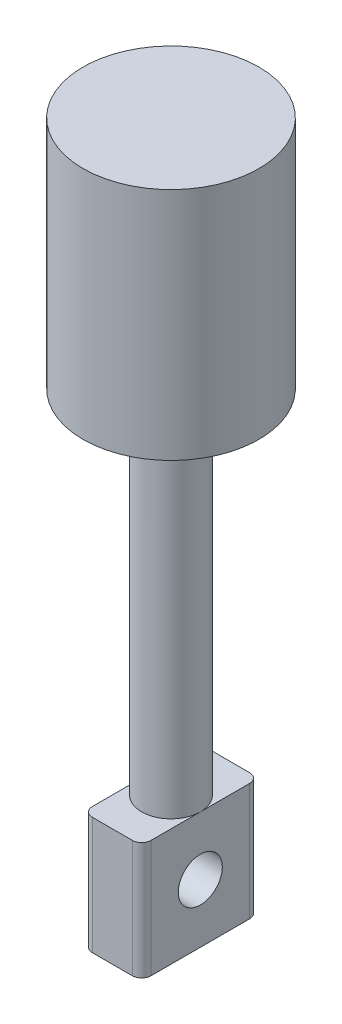
ISO-10303-21;
HEADER;
FILE_DESCRIPTION(('STEP AP214'),'2;1');
FILE_NAME('part.step','',(''),(''),'','','');
FILE_SCHEMA(('AUTOMOTIVE_DESIGN { 1 0 10303 214 1 1 1 1 }'));
ENDSEC;
DATA;
#1=APPLICATION_CONTEXT('core data for automotive mechanical design processes');
#2=APPLICATION_PROTOCOL_DEFINITION('international standard','automotive_design',2000,#1);
#3=PRODUCT_CONTEXT('',#1,'mechanical');
#4=PRODUCT('Part','Part','',(#3));
#5=PRODUCT_RELATED_PRODUCT_CATEGORY('part','',(#4));
#6=PRODUCT_DEFINITION_FORMATION('','',#4);
#7=PRODUCT_DEFINITION_CONTEXT('part definition',#1,'design');
#8=PRODUCT_DEFINITION('design','',#6,#7);
#9=PRODUCT_DEFINITION_SHAPE('','',#8);
#10=(LENGTH_UNIT() NAMED_UNIT(*) SI_UNIT(.MILLI.,.METRE.));
#11=(NAMED_UNIT(*) PLANE_ANGLE_UNIT() SI_UNIT($,.RADIAN.));
#12=(NAMED_UNIT(*) SI_UNIT($,.STERADIAN.) SOLID_ANGLE_UNIT());
#13=UNCERTAINTY_MEASURE_WITH_UNIT(LENGTH_MEASURE(1.E-05),#10,'distance_accuracy_value','');
#14=(GEOMETRIC_REPRESENTATION_CONTEXT(3) GLOBAL_UNCERTAINTY_ASSIGNED_CONTEXT((#13)) GLOBAL_UNIT_ASSIGNED_CONTEXT((#10,
#11,#12)) REPRESENTATION_CONTEXT('',''));
#15=CARTESIAN_POINT('',(0.,0.,0.));
#16=DIRECTION('',(0.,0.,1.));
#17=DIRECTION('',(1.,0.,0.));
#18=AXIS2_PLACEMENT_3D('',#15,#16,#17);
#19=CARTESIAN_POINT('',(0.,-12.7,0.));
#20=DIRECTION('',(0.,1.,0.));
#21=DIRECTION('',(0.,0.,1.));
#22=AXIS2_PLACEMENT_3D('',#19,#20,#21);
#23=CYLINDRICAL_SURFACE('',#22,4.7625);
#24=CARTESIAN_POINT('',(0.,-12.7,0.));
#25=DIRECTION('',(0.,1.,0.));
#26=DIRECTION('',(0.,0.,1.));
#27=AXIS2_PLACEMENT_3D('',#24,#25,#26);
#28=CIRCLE('',#27,4.7625);
#29=CARTESIAN_POINT('',(0.,-12.7,4.7625));
#30=VERTEX_POINT('',#29);
#31=EDGE_CURVE('E163',#30,#30,#28,.T.);
#32=ORIENTED_EDGE('',*,*,#31,.T.);
#33=EDGE_LOOP('',(#32));
#34=FACE_BOUND('',#33,.T.);
#35=CARTESIAN_POINT('',(0.,0.,0.));
#36=DIRECTION('',(0.,1.,0.));
#37=DIRECTION('',(0.,0.,1.));
#38=AXIS2_PLACEMENT_3D('',#35,#36,#37);
#39=CIRCLE('',#38,4.7625);
#40=CARTESIAN_POINT('',(0.,0.,4.7625));
#41=VERTEX_POINT('',#40);
#42=EDGE_CURVE('E132',#41,#41,#39,.T.);
#43=ORIENTED_EDGE('',*,*,#42,.F.);
#44=EDGE_LOOP('',(#43));
#45=FACE_BOUND('',#44,.T.);
#46=ADVANCED_FACE('F37',(#34,#45),#23,.T.);
#47=CARTESIAN_POINT('',(0.,-12.7,0.));
#48=DIRECTION('',(0.,1.,0.));
#49=DIRECTION('',(0.,0.,1.));
#50=AXIS2_PLACEMENT_3D('',#47,#48,#49);
#51=PLANE('',#50);
#52=CARTESIAN_POINT('',(0.,-12.7,0.));
#53=DIRECTION('',(0.,-1.,0.));
#54=DIRECTION('',(0.,0.,-1.));
#55=AXIS2_PLACEMENT_3D('',#52,#53,#54);
#56=CIRCLE('',#55,1.5875);
#57=CARTESIAN_POINT('',(0.,-12.7,-1.5875));
#58=VERTEX_POINT('',#57);
#59=EDGE_CURVE('E159',#58,#58,#56,.T.);
#60=ORIENTED_EDGE('',*,*,#59,.F.);
#61=EDGE_LOOP('',(#60));
#62=FACE_BOUND('',#61,.T.);
#63=ORIENTED_EDGE('',*,*,#31,.F.);
#64=EDGE_LOOP('',(#63));
#65=FACE_BOUND('',#64,.T.);
#66=ADVANCED_FACE('F225',(#62,#65),#51,.F.);
#67=CARTESIAN_POINT('',(0.,0.,0.));
#68=DIRECTION('',(0.,1.,0.));
#69=DIRECTION('',(0.,0.,1.));
#70=AXIS2_PLACEMENT_3D('',#67,#68,#69);
#71=PLANE('',#70);
#72=ORIENTED_EDGE('',*,*,#42,.T.);
#73=EDGE_LOOP('',(#72));
#74=FACE_BOUND('',#73,.T.);
#75=ADVANCED_FACE('F231',(#74),#71,.T.);
#76=CARTESIAN_POINT('',(0.,-31.75,0.));
#77=DIRECTION('',(0.,1.,0.));
#78=DIRECTION('',(0.,0.,1.));
#79=AXIS2_PLACEMENT_3D('',#76,#77,#78);
#80=CYLINDRICAL_SURFACE('',#79,1.5875);
#81=CARTESIAN_POINT('',(0.,-31.75,0.));
#82=DIRECTION('',(0.,-1.,0.));
#83=DIRECTION('',(0.,0.,-1.));
#84=AXIS2_PLACEMENT_3D('',#81,#82,#83);
#85=CIRCLE('',#84,1.5875);
#86=CARTESIAN_POINT('',(1.5875,-31.75,0.));
#87=VERTEX_POINT('',#86);
#88=CARTESIAN_POINT('',(-1.5875,-31.75,0.));
#89=VERTEX_POINT('',#88);
#90=EDGE_CURVE('E127',#87,#89,#85,.T.);
#91=ORIENTED_EDGE('',*,*,#90,.F.);
#92=EDGE_CURVE('E130',#89,#87,#85,.T.);
#93=ORIENTED_EDGE('',*,*,#92,.F.);
#94=EDGE_LOOP('',(#91,#93));
#95=FACE_BOUND('',#94,.T.);
#96=ORIENTED_EDGE('',*,*,#59,.T.);
#97=EDGE_LOOP('',(#96));
#98=FACE_BOUND('',#97,.T.);
#99=ADVANCED_FACE('F128',(#95,#98),#80,.T.);
#100=CARTESIAN_POINT('',(1.5875,-31.75,3.175));
#101=DIRECTION('',(0.,-1.,0.));
#102=DIRECTION('',(0.,0.,-1.));
#103=AXIS2_PLACEMENT_3D('',#100,#101,#102);
#104=PLANE('',#103);
#105=DIRECTION('',(-1.,0.,0.));
#106=VECTOR('',#105,1.);
#107=CARTESIAN_POINT('',(1.5875,-31.75,3.175));
#108=LINE('',#107,#106);
#109=CARTESIAN_POINT('',(1.0795,-31.75,3.175));
#110=VERTEX_POINT('',#109);
#111=CARTESIAN_POINT('',(-1.0795,-31.75,3.175));
#112=VERTEX_POINT('',#111);
#113=EDGE_CURVE('E122',#110,#112,#108,.T.);
#114=ORIENTED_EDGE('',*,*,#113,.F.);
#115=CARTESIAN_POINT('',(1.0795,-31.75,2.667));
#116=DIRECTION('',(0.,-1.,0.));
#117=DIRECTION('',(0.,0.,-1.));
#118=AXIS2_PLACEMENT_3D('',#115,#116,#117);
#119=CIRCLE('',#118,0.508);
#120=CARTESIAN_POINT('',(1.5875,-31.75,2.667));
#121=VERTEX_POINT('',#120);
#122=EDGE_CURVE('E11',#110,#121,#119,.F.);
#123=ORIENTED_EDGE('',*,*,#122,.T.);
#124=DIRECTION('',(0.,0.,1.));
#125=VECTOR('',#124,1.);
#126=CARTESIAN_POINT('',(1.5875,-31.75,3.175));
#127=LINE('',#126,#125);
#128=EDGE_CURVE('E116',#87,#121,#127,.T.);
#129=ORIENTED_EDGE('',*,*,#128,.F.);
#130=ORIENTED_EDGE('',*,*,#90,.T.);
#131=DIRECTION('',(0.,0.,1.));
#132=VECTOR('',#131,1.);
#133=CARTESIAN_POINT('',(-1.5875,-31.75,3.175));
#134=LINE('',#133,#132);
#135=CARTESIAN_POINT('',(-1.5875,-31.75,2.667));
#136=VERTEX_POINT('',#135);
#137=EDGE_CURVE('E148',#89,#136,#134,.T.);
#138=ORIENTED_EDGE('',*,*,#137,.T.);
#139=CARTESIAN_POINT('',(-1.0795,-31.75,2.667));
#140=DIRECTION('',(0.,-1.,0.));
#141=DIRECTION('',(0.,0.,-1.));
#142=AXIS2_PLACEMENT_3D('',#139,#140,#141);
#143=CIRCLE('',#142,0.508);
#144=EDGE_CURVE('E45',#136,#112,#143,.F.);
#145=ORIENTED_EDGE('',*,*,#144,.T.);
#146=EDGE_LOOP('',(#114,#123,#129,#130,#138,#145));
#147=FACE_BOUND('',#146,.T.);
#148=ADVANCED_FACE('F139',(#147),#104,.F.);
#149=DIRECTION('',(-1.,0.,0.));
#150=VECTOR('',#149,1.);
#151=CARTESIAN_POINT('',(1.5875,-31.75,-3.175));
#152=LINE('',#151,#150);
#153=CARTESIAN_POINT('',(1.0795,-31.75,-3.175));
#154=VERTEX_POINT('',#153);
#155=CARTESIAN_POINT('',(-1.0795,-31.75,-3.175));
#156=VERTEX_POINT('',#155);
#157=EDGE_CURVE('E152',#154,#156,#152,.T.);
#158=ORIENTED_EDGE('',*,*,#157,.T.);
#159=CARTESIAN_POINT('',(-1.0795,-31.75,-2.667));
#160=DIRECTION('',(0.,-1.,0.));
#161=DIRECTION('',(0.,0.,-1.));
#162=AXIS2_PLACEMENT_3D('',#159,#160,#161);
#163=CIRCLE('',#162,0.508);
#164=CARTESIAN_POINT('',(-1.5875,-31.75,-2.667));
#165=VERTEX_POINT('',#164);
#166=EDGE_CURVE('E174',#156,#165,#163,.F.);
#167=ORIENTED_EDGE('',*,*,#166,.T.);
#168=EDGE_CURVE('E137',#165,#89,#134,.T.);
#169=ORIENTED_EDGE('',*,*,#168,.T.);
#170=ORIENTED_EDGE('',*,*,#92,.T.);
#171=CARTESIAN_POINT('',(1.5875,-31.75,-2.667));
#172=VERTEX_POINT('',#171);
#173=EDGE_CURVE('E109',#172,#87,#127,.T.);
#174=ORIENTED_EDGE('',*,*,#173,.F.);
#175=CARTESIAN_POINT('',(1.0795,-31.75,-2.667));
#176=DIRECTION('',(0.,-1.,0.));
#177=DIRECTION('',(0.,0.,-1.));
#178=AXIS2_PLACEMENT_3D('',#175,#176,#177);
#179=CIRCLE('',#178,0.508);
#180=EDGE_CURVE('E172',#172,#154,#179,.F.);
#181=ORIENTED_EDGE('',*,*,#180,.T.);
#182=EDGE_LOOP('',(#158,#167,#169,#170,#174,#181));
#183=FACE_BOUND('',#182,.T.);
#184=ADVANCED_FACE('F135',(#183),#104,.F.);
#185=CARTESIAN_POINT('',(1.5875,0.,0.));
#186=DIRECTION('',(1.,0.,0.));
#187=DIRECTION('',(0.,0.,-1.));
#188=AXIS2_PLACEMENT_3D('',#185,#186,#187);
#189=PLANE('',#188);
#190=DIRECTION('',(0.,0.,-1.));
#191=VECTOR('',#190,1.);
#192=CARTESIAN_POINT('',(1.5875,-38.1,3.175));
#193=LINE('',#192,#191);
#194=CARTESIAN_POINT('',(1.5875,-38.1,2.667));
#195=VERTEX_POINT('',#194);
#196=CARTESIAN_POINT('',(1.5875,-38.1,-2.667));
#197=VERTEX_POINT('',#196);
#198=EDGE_CURVE('E141',#195,#197,#193,.T.);
#199=ORIENTED_EDGE('',*,*,#198,.T.);
#200=DIRECTION('',(0.,1.,0.));
#201=VECTOR('',#200,1.);
#202=CARTESIAN_POINT('',(1.5875,-31.75,-2.667));
#203=LINE('',#202,#201);
#204=EDGE_CURVE('E119',#197,#172,#203,.T.);
#205=ORIENTED_EDGE('',*,*,#204,.T.);
#206=ORIENTED_EDGE('',*,*,#173,.T.);
#207=ORIENTED_EDGE('',*,*,#128,.T.);
#208=DIRECTION('',(0.,-1.,0.));
#209=VECTOR('',#208,1.);
#210=CARTESIAN_POINT('',(1.5875,-38.1,2.667));
#211=LINE('',#210,#209);
#212=EDGE_CURVE('E188',#121,#195,#211,.T.);
#213=ORIENTED_EDGE('',*,*,#212,.T.);
#214=EDGE_LOOP('',(#199,#205,#206,#207,#213));
#215=FACE_BOUND('',#214,.T.);
#216=CARTESIAN_POINT('',(1.5875,-34.925,0.));
#217=DIRECTION('',(1.,0.,0.));
#218=DIRECTION('',(0.,0.,-1.));
#219=AXIS2_PLACEMENT_3D('',#216,#217,#218);
#220=CIRCLE('',#219,1.190625);
#221=CARTESIAN_POINT('',(1.5875,-34.925,-1.190625));
#222=VERTEX_POINT('',#221);
#223=EDGE_CURVE('E149',#222,#222,#220,.T.);
#224=ORIENTED_EDGE('',*,*,#223,.F.);
#225=EDGE_LOOP('',(#224));
#226=FACE_BOUND('',#225,.T.);
#227=ADVANCED_FACE('F112',(#215,#226),#189,.T.);
#228=CARTESIAN_POINT('',(-1.5875,0.,0.));
#229=DIRECTION('',(1.,0.,0.));
#230=DIRECTION('',(0.,0.,-1.));
#231=AXIS2_PLACEMENT_3D('',#228,#229,#230);
#232=PLANE('',#231);
#233=ORIENTED_EDGE('',*,*,#168,.F.);
#234=DIRECTION('',(0.,1.,0.));
#235=VECTOR('',#234,1.);
#236=CARTESIAN_POINT('',(-1.5875,0.,-2.66699999999999));
#237=LINE('',#236,#235);
#238=CARTESIAN_POINT('',(-1.5875,-38.1,-2.667));
#239=VERTEX_POINT('',#238);
#240=EDGE_CURVE('E178',#165,#239,#237,.F.);
#241=ORIENTED_EDGE('',*,*,#240,.T.);
#242=DIRECTION('',(0.,0.,-1.));
#243=VECTOR('',#242,1.);
#244=CARTESIAN_POINT('',(-1.5875,-38.1,3.175));
#245=LINE('',#244,#243);
#246=CARTESIAN_POINT('',(-1.5875,-38.1,2.667));
#247=VERTEX_POINT('',#246);
#248=EDGE_CURVE('E145',#247,#239,#245,.T.);
#249=ORIENTED_EDGE('',*,*,#248,.F.);
#250=DIRECTION('',(0.,-1.,0.));
#251=VECTOR('',#250,1.);
#252=CARTESIAN_POINT('',(-1.5875,0.,2.66699999999999));
#253=LINE('',#252,#251);
#254=EDGE_CURVE('E176',#247,#136,#253,.F.);
#255=ORIENTED_EDGE('',*,*,#254,.T.);
#256=ORIENTED_EDGE('',*,*,#137,.F.);
#257=EDGE_LOOP('',(#233,#241,#249,#255,#256));
#258=FACE_BOUND('',#257,.T.);
#259=CARTESIAN_POINT('',(-1.5875,-34.925,0.));
#260=DIRECTION('',(1.,0.,0.));
#261=DIRECTION('',(0.,0.,-1.));
#262=AXIS2_PLACEMENT_3D('',#259,#260,#261);
#263=CIRCLE('',#262,1.190625);
#264=CARTESIAN_POINT('',(-1.5875,-34.925,-1.190625));
#265=VERTEX_POINT('',#264);
#266=EDGE_CURVE('E391',#265,#265,#263,.T.);
#267=ORIENTED_EDGE('',*,*,#266,.T.);
#268=EDGE_LOOP('',(#267));
#269=FACE_BOUND('',#268,.T.);
#270=ADVANCED_FACE('F217',(#258,#269),#232,.F.);
#271=CARTESIAN_POINT('',(1.5875,-31.75,3.175));
#272=DIRECTION('',(0.,0.,-1.));
#273=DIRECTION('',(0.,1.,0.));
#274=AXIS2_PLACEMENT_3D('',#271,#272,#273);
#275=PLANE('',#274);
#276=DIRECTION('',(-1.,0.,0.));
#277=VECTOR('',#276,1.);
#278=CARTESIAN_POINT('',(1.5875,-38.1,3.175));
#279=LINE('',#278,#277);
#280=CARTESIAN_POINT('',(1.0795,-38.1,3.175));
#281=VERTEX_POINT('',#280);
#282=CARTESIAN_POINT('',(-1.0795,-38.1,3.175));
#283=VERTEX_POINT('',#282);
#284=EDGE_CURVE('E138',#281,#283,#279,.T.);
#285=ORIENTED_EDGE('',*,*,#284,.F.);
#286=DIRECTION('',(0.,-1.,0.));
#287=VECTOR('',#286,1.);
#288=CARTESIAN_POINT('',(1.0795,-31.75,3.175));
#289=LINE('',#288,#287);
#290=EDGE_CURVE('E58',#281,#110,#289,.F.);
#291=ORIENTED_EDGE('',*,*,#290,.T.);
#292=ORIENTED_EDGE('',*,*,#113,.T.);
#293=DIRECTION('',(0.,-1.,0.));
#294=VECTOR('',#293,1.);
#295=CARTESIAN_POINT('',(-1.0795,-31.75,3.175));
#296=LINE('',#295,#294);
#297=EDGE_CURVE('E191',#112,#283,#296,.T.);
#298=ORIENTED_EDGE('',*,*,#297,.T.);
#299=EDGE_LOOP('',(#285,#291,#292,#298));
#300=FACE_BOUND('',#299,.T.);
#301=ADVANCED_FACE('F195',(#300),#275,.F.);
#302=CARTESIAN_POINT('',(1.5875,-38.1,3.175));
#303=DIRECTION('',(0.,1.,0.));
#304=DIRECTION('',(0.,0.,1.));
#305=AXIS2_PLACEMENT_3D('',#302,#303,#304);
#306=PLANE('',#305);
#307=ORIENTED_EDGE('',*,*,#248,.T.);
#308=CARTESIAN_POINT('',(-1.0795,-38.1,-2.667));
#309=DIRECTION('',(0.,1.,0.));
#310=DIRECTION('',(0.,0.,1.));
#311=AXIS2_PLACEMENT_3D('',#308,#309,#310);
#312=CIRCLE('',#311,0.508);
#313=CARTESIAN_POINT('',(-1.0795,-38.1,-3.175));
#314=VERTEX_POINT('',#313);
#315=EDGE_CURVE('E186',#239,#314,#312,.F.);
#316=ORIENTED_EDGE('',*,*,#315,.T.);
#317=DIRECTION('',(-1.,0.,0.));
#318=VECTOR('',#317,1.);
#319=CARTESIAN_POINT('',(1.5875,-38.1,-3.175));
#320=LINE('',#319,#318);
#321=CARTESIAN_POINT('',(1.0795,-38.1,-3.175));
#322=VERTEX_POINT('',#321);
#323=EDGE_CURVE('E154',#322,#314,#320,.T.);
#324=ORIENTED_EDGE('',*,*,#323,.F.);
#325=CARTESIAN_POINT('',(1.0795,-38.1,-2.667));
#326=DIRECTION('',(0.,1.,0.));
#327=DIRECTION('',(0.,0.,1.));
#328=AXIS2_PLACEMENT_3D('',#325,#326,#327);
#329=CIRCLE('',#328,0.508);
#330=EDGE_CURVE('E184',#322,#197,#329,.F.);
#331=ORIENTED_EDGE('',*,*,#330,.T.);
#332=ORIENTED_EDGE('',*,*,#198,.F.);
#333=CARTESIAN_POINT('',(1.0795,-38.1,2.667));
#334=DIRECTION('',(0.,1.,0.));
#335=DIRECTION('',(0.,0.,1.));
#336=AXIS2_PLACEMENT_3D('',#333,#334,#335);
#337=CIRCLE('',#336,0.508);
#338=EDGE_CURVE('E182',#195,#281,#337,.F.);
#339=ORIENTED_EDGE('',*,*,#338,.T.);
#340=ORIENTED_EDGE('',*,*,#284,.T.);
#341=CARTESIAN_POINT('',(-1.0795,-38.1,2.667));
#342=DIRECTION('',(0.,1.,0.));
#343=DIRECTION('',(0.,0.,1.));
#344=AXIS2_PLACEMENT_3D('',#341,#342,#343);
#345=CIRCLE('',#344,0.508);
#346=EDGE_CURVE('E180',#283,#247,#345,.F.);
#347=ORIENTED_EDGE('',*,*,#346,.T.);
#348=EDGE_LOOP('',(#307,#316,#324,#331,#332,#339,#340,#347));
#349=FACE_BOUND('',#348,.T.);
#350=ADVANCED_FACE('F198',(#349),#306,.F.);
#351=CARTESIAN_POINT('',(1.5875,-31.75,-3.175));
#352=DIRECTION('',(0.,0.,1.));
#353=DIRECTION('',(0.,-1.,0.));
#354=AXIS2_PLACEMENT_3D('',#351,#352,#353);
#355=PLANE('',#354);
#356=ORIENTED_EDGE('',*,*,#323,.T.);
#357=DIRECTION('',(0.,1.,0.));
#358=VECTOR('',#357,1.);
#359=CARTESIAN_POINT('',(-1.0795,-31.75,-3.175));
#360=LINE('',#359,#358);
#361=EDGE_CURVE('E169',#314,#156,#360,.T.);
#362=ORIENTED_EDGE('',*,*,#361,.T.);
#363=ORIENTED_EDGE('',*,*,#157,.F.);
#364=DIRECTION('',(0.,1.,0.));
#365=VECTOR('',#364,1.);
#366=CARTESIAN_POINT('',(1.0795,-38.1,-3.175));
#367=LINE('',#366,#365);
#368=EDGE_CURVE('E162',#154,#322,#367,.F.);
#369=ORIENTED_EDGE('',*,*,#368,.T.);
#370=EDGE_LOOP('',(#356,#362,#363,#369));
#371=FACE_BOUND('',#370,.T.);
#372=ADVANCED_FACE('F209',(#371),#355,.F.);
#373=CARTESIAN_POINT('',(1.5875,-34.925,0.));
#374=DIRECTION('',(-1.,0.,0.));
#375=DIRECTION('',(0.,0.,1.));
#376=AXIS2_PLACEMENT_3D('',#373,#374,#375);
#377=CYLINDRICAL_SURFACE('',#376,1.190625);
#378=ORIENTED_EDGE('',*,*,#223,.T.);
#379=EDGE_LOOP('',(#378));
#380=FACE_BOUND('',#379,.T.);
#381=ORIENTED_EDGE('',*,*,#266,.F.);
#382=EDGE_LOOP('',(#381));
#383=FACE_BOUND('',#382,.T.);
#384=ADVANCED_FACE('F239',(#380,#383),#377,.F.);
#385=CARTESIAN_POINT('',(-1.0795,-31.75,-2.667));
#386=DIRECTION('',(0.,1.,0.));
#387=DIRECTION('',(0.,0.,1.));
#388=AXIS2_PLACEMENT_3D('',#385,#386,#387);
#389=CYLINDRICAL_SURFACE('',#388,0.508);
#390=ORIENTED_EDGE('',*,*,#315,.F.);
#391=ORIENTED_EDGE('',*,*,#240,.F.);
#392=ORIENTED_EDGE('',*,*,#166,.F.);
#393=ORIENTED_EDGE('',*,*,#361,.F.);
#394=EDGE_LOOP('',(#390,#391,#392,#393));
#395=FACE_BOUND('',#394,.T.);
#396=ADVANCED_FACE('F214',(#395),#389,.T.);
#397=CARTESIAN_POINT('',(1.0795,0.,-2.66699999999999));
#398=DIRECTION('',(0.,-1.,0.));
#399=DIRECTION('',(0.,0.,-1.));
#400=AXIS2_PLACEMENT_3D('',#397,#398,#399);
#401=CYLINDRICAL_SURFACE('',#400,0.508);
#402=ORIENTED_EDGE('',*,*,#330,.F.);
#403=ORIENTED_EDGE('',*,*,#368,.F.);
#404=ORIENTED_EDGE('',*,*,#180,.F.);
#405=ORIENTED_EDGE('',*,*,#204,.F.);
#406=EDGE_LOOP('',(#402,#403,#404,#405));
#407=FACE_BOUND('',#406,.T.);
#408=ADVANCED_FACE('F205',(#407),#401,.T.);
#409=CARTESIAN_POINT('',(1.0795,0.,2.66699999999999));
#410=DIRECTION('',(0.,1.,0.));
#411=DIRECTION('',(0.,0.,1.));
#412=AXIS2_PLACEMENT_3D('',#409,#410,#411);
#413=CYLINDRICAL_SURFACE('',#412,0.508);
#414=ORIENTED_EDGE('',*,*,#122,.F.);
#415=ORIENTED_EDGE('',*,*,#290,.F.);
#416=ORIENTED_EDGE('',*,*,#338,.F.);
#417=ORIENTED_EDGE('',*,*,#212,.F.);
#418=EDGE_LOOP('',(#414,#415,#416,#417));
#419=FACE_BOUND('',#418,.T.);
#420=ADVANCED_FACE('F202',(#419),#413,.T.);
#421=CARTESIAN_POINT('',(-1.0795,-31.75,2.667));
#422=DIRECTION('',(0.,-1.,0.));
#423=DIRECTION('',(0.,0.,-1.));
#424=AXIS2_PLACEMENT_3D('',#421,#422,#423);
#425=CYLINDRICAL_SURFACE('',#424,0.508);
#426=ORIENTED_EDGE('',*,*,#144,.F.);
#427=ORIENTED_EDGE('',*,*,#254,.F.);
#428=ORIENTED_EDGE('',*,*,#346,.F.);
#429=ORIENTED_EDGE('',*,*,#297,.F.);
#430=EDGE_LOOP('',(#426,#427,#428,#429));
#431=FACE_BOUND('',#430,.T.);
#432=ADVANCED_FACE('F39',(#431),#425,.T.);
#433=CLOSED_SHELL('',(#46,#66,#75,#99,#148,#184,#227,#270,#301,#350,#372,#384,#396,#408,#420,#432));
#434=MANIFOLD_SOLID_BREP('B2',#433);
#435=ADVANCED_BREP_SHAPE_REPRESENTATION('',(#18,#434),#14);
#436=SHAPE_DEFINITION_REPRESENTATION(#9,#435);
ENDSEC;
END-ISO-10303-21;
